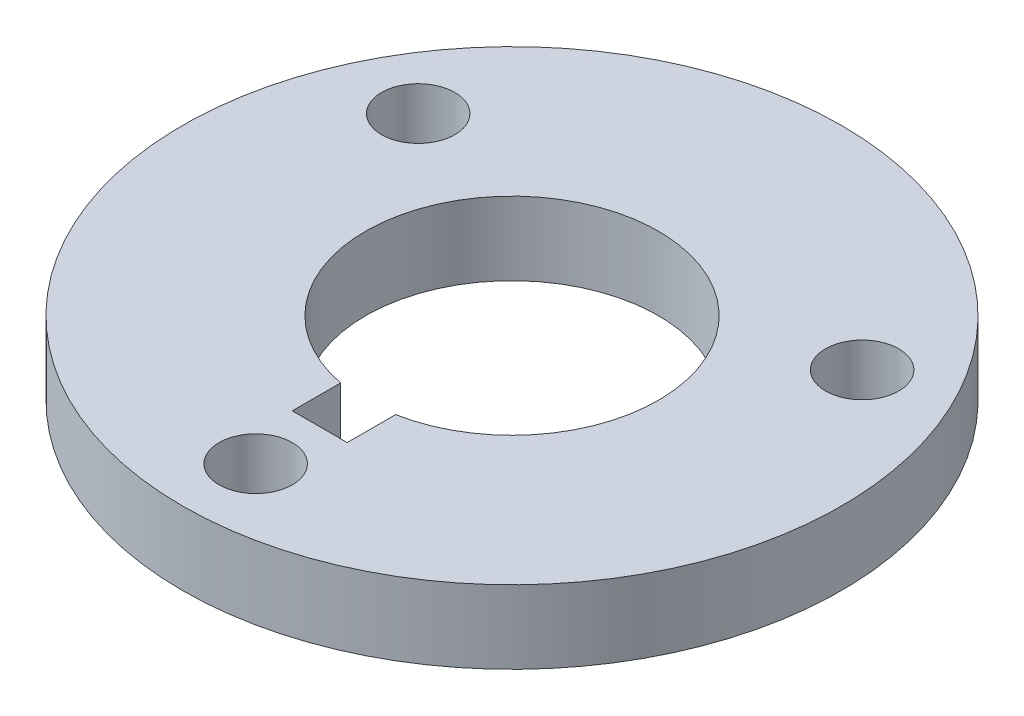
ISO-10303-21;
HEADER;
FILE_DESCRIPTION(('STEP AP214'),'2;1');
FILE_NAME('part.step','',(''),(''),'','','');
FILE_SCHEMA(('AUTOMOTIVE_DESIGN { 1 0 10303 214 1 1 1 1 }'));
ENDSEC;
DATA;
#1=APPLICATION_CONTEXT('core data for automotive mechanical design processes');
#2=APPLICATION_PROTOCOL_DEFINITION('international standard','automotive_design',2000,#1);
#3=PRODUCT_CONTEXT('',#1,'mechanical');
#4=PRODUCT('Part','Part','',(#3));
#5=PRODUCT_RELATED_PRODUCT_CATEGORY('part','',(#4));
#6=PRODUCT_DEFINITION_FORMATION('','',#4);
#7=PRODUCT_DEFINITION_CONTEXT('part definition',#1,'design');
#8=PRODUCT_DEFINITION('design','',#6,#7);
#9=PRODUCT_DEFINITION_SHAPE('','',#8);
#10=(LENGTH_UNIT() NAMED_UNIT(*) SI_UNIT(.MILLI.,.METRE.));
#11=(NAMED_UNIT(*) PLANE_ANGLE_UNIT() SI_UNIT($,.RADIAN.));
#12=(NAMED_UNIT(*) SI_UNIT($,.STERADIAN.) SOLID_ANGLE_UNIT());
#13=UNCERTAINTY_MEASURE_WITH_UNIT(LENGTH_MEASURE(1.E-05),#10,'distance_accuracy_value','');
#14=(GEOMETRIC_REPRESENTATION_CONTEXT(3) GLOBAL_UNCERTAINTY_ASSIGNED_CONTEXT((#13)) GLOBAL_UNIT_ASSIGNED_CONTEXT((#10,
#11,#12)) REPRESENTATION_CONTEXT('',''));
#15=CARTESIAN_POINT('',(0.,0.,0.));
#16=DIRECTION('',(0.,0.,1.));
#17=DIRECTION('',(1.,0.,0.));
#18=AXIS2_PLACEMENT_3D('',#15,#16,#17);
#19=CARTESIAN_POINT('',(0.,3.175,0.));
#20=DIRECTION('',(0.,-1.,0.));
#21=DIRECTION('',(0.,0.,-1.));
#22=AXIS2_PLACEMENT_3D('',#19,#20,#21);
#23=CYLINDRICAL_SURFACE('',#22,6.35);
#24=CARTESIAN_POINT('',(0.,0.,0.));
#25=DIRECTION('',(0.,1.,0.));
#26=DIRECTION('',(0.,0.,1.));
#27=AXIS2_PLACEMENT_3D('',#24,#25,#26);
#28=CIRCLE('',#27,6.35);
#29=CARTESIAN_POINT('',(1.190625,0.,6.23738022805849));
#30=VERTEX_POINT('',#29);
#31=CARTESIAN_POINT('',(-1.190625,0.,6.23738022805849));
#32=VERTEX_POINT('',#31);
#33=EDGE_CURVE('E109',#30,#32,#28,.T.);
#34=ORIENTED_EDGE('',*,*,#33,.F.);
#35=DIRECTION('',(0.,-1.,0.));
#36=VECTOR('',#35,1.);
#37=CARTESIAN_POINT('',(1.190625,3.175,6.23738022805849));
#38=LINE('',#37,#36);
#39=CARTESIAN_POINT('',(1.190625,3.175,6.23738022805849));
#40=VERTEX_POINT('',#39);
#41=EDGE_CURVE('E11',#40,#30,#38,.T.);
#42=ORIENTED_EDGE('',*,*,#41,.F.);
#43=CARTESIAN_POINT('',(0.,3.175,0.));
#44=DIRECTION('',(0.,1.,0.));
#45=DIRECTION('',(0.,0.,1.));
#46=AXIS2_PLACEMENT_3D('',#43,#44,#45);
#47=CIRCLE('',#46,6.35);
#48=CARTESIAN_POINT('',(-1.190625,3.175,6.23738022805849));
#49=VERTEX_POINT('',#48);
#50=EDGE_CURVE('E82',#40,#49,#47,.T.);
#51=ORIENTED_EDGE('',*,*,#50,.T.);
#52=DIRECTION('',(0.,-1.,0.));
#53=VECTOR('',#52,1.);
#54=CARTESIAN_POINT('',(-1.190625,3.175,6.23738022805849));
#55=LINE('',#54,#53);
#56=EDGE_CURVE('E49',#49,#32,#55,.T.);
#57=ORIENTED_EDGE('',*,*,#56,.T.);
#58=EDGE_LOOP('',(#34,#42,#51,#57));
#59=FACE_BOUND('',#58,.T.);
#60=ADVANCED_FACE('F32',(#59),#23,.F.);
#61=CARTESIAN_POINT('',(1.190625,3.175,0.));
#62=DIRECTION('',(1.,0.,0.));
#63=DIRECTION('',(0.,0.,-1.));
#64=AXIS2_PLACEMENT_3D('',#61,#62,#63);
#65=PLANE('',#64);
#66=DIRECTION('',(0.,0.,1.));
#67=VECTOR('',#66,1.);
#68=CARTESIAN_POINT('',(1.190625,0.,0.));
#69=LINE('',#68,#67);
#70=CARTESIAN_POINT('',(1.190625,0.,8.334375));
#71=VERTEX_POINT('',#70);
#72=EDGE_CURVE('E88',#30,#71,#69,.T.);
#73=ORIENTED_EDGE('',*,*,#72,.T.);
#74=DIRECTION('',(0.,-1.,0.));
#75=VECTOR('',#74,1.);
#76=CARTESIAN_POINT('',(1.190625,3.175,8.334375));
#77=LINE('',#76,#75);
#78=CARTESIAN_POINT('',(1.190625,3.175,8.334375));
#79=VERTEX_POINT('',#78);
#80=EDGE_CURVE('E41',#79,#71,#77,.T.);
#81=ORIENTED_EDGE('',*,*,#80,.F.);
#82=DIRECTION('',(0.,0.,1.));
#83=VECTOR('',#82,1.);
#84=CARTESIAN_POINT('',(1.190625,3.175,0.));
#85=LINE('',#84,#83);
#86=EDGE_CURVE('E75',#40,#79,#85,.T.);
#87=ORIENTED_EDGE('',*,*,#86,.F.);
#88=ORIENTED_EDGE('',*,*,#41,.T.);
#89=EDGE_LOOP('',(#73,#81,#87,#88));
#90=FACE_BOUND('',#89,.T.);
#91=ADVANCED_FACE('F86',(#90),#65,.F.);
#92=CARTESIAN_POINT('',(0.,3.175,8.334375));
#93=DIRECTION('',(0.,0.,-1.));
#94=DIRECTION('',(-1.,0.,0.));
#95=AXIS2_PLACEMENT_3D('',#92,#93,#94);
#96=PLANE('',#95);
#97=DIRECTION('',(1.,0.,0.));
#98=VECTOR('',#97,1.);
#99=CARTESIAN_POINT('',(0.,0.,8.334375));
#100=LINE('',#99,#98);
#101=CARTESIAN_POINT('',(-1.190625,0.,8.334375));
#102=VERTEX_POINT('',#101);
#103=EDGE_CURVE('E112',#102,#71,#100,.T.);
#104=ORIENTED_EDGE('',*,*,#103,.F.);
#105=DIRECTION('',(0.,-1.,0.));
#106=VECTOR('',#105,1.);
#107=CARTESIAN_POINT('',(-1.190625,3.175,8.334375));
#108=LINE('',#107,#106);
#109=CARTESIAN_POINT('',(-1.190625,3.175,8.334375));
#110=VERTEX_POINT('',#109);
#111=EDGE_CURVE('E62',#110,#102,#108,.T.);
#112=ORIENTED_EDGE('',*,*,#111,.F.);
#113=DIRECTION('',(1.,0.,0.));
#114=VECTOR('',#113,1.);
#115=CARTESIAN_POINT('',(0.,3.175,8.334375));
#116=LINE('',#115,#114);
#117=EDGE_CURVE('E81',#110,#79,#116,.T.);
#118=ORIENTED_EDGE('',*,*,#117,.T.);
#119=ORIENTED_EDGE('',*,*,#80,.T.);
#120=EDGE_LOOP('',(#104,#112,#118,#119));
#121=FACE_BOUND('',#120,.T.);
#122=ADVANCED_FACE('F91',(#121),#96,.T.);
#123=CARTESIAN_POINT('',(9.62370729955481,3.175,-5.55625000000014));
#124=DIRECTION('',(0.,-1.,0.));
#125=DIRECTION('',(0.,0.,-1.));
#126=AXIS2_PLACEMENT_3D('',#123,#124,#125);
#127=CYLINDRICAL_SURFACE('',#126,1.5875);
#128=CARTESIAN_POINT('',(9.62370729955481,3.175,-5.55625000000014));
#129=DIRECTION('',(0.,1.,0.));
#130=DIRECTION('',(0.,0.,1.));
#131=AXIS2_PLACEMENT_3D('',#128,#129,#130);
#132=CIRCLE('',#131,1.5875);
#133=CARTESIAN_POINT('',(9.62370729955481,3.175,-3.96875000000014));
#134=VERTEX_POINT('',#133);
#135=EDGE_CURVE('E100',#134,#134,#132,.T.);
#136=ORIENTED_EDGE('',*,*,#135,.T.);
#137=EDGE_LOOP('',(#136));
#138=FACE_BOUND('',#137,.T.);
#139=CARTESIAN_POINT('',(9.62370729955481,0.,-5.55625000000014));
#140=DIRECTION('',(0.,1.,0.));
#141=DIRECTION('',(0.,0.,1.));
#142=AXIS2_PLACEMENT_3D('',#139,#140,#141);
#143=CIRCLE('',#142,1.5875);
#144=CARTESIAN_POINT('',(9.62370729955481,0.,-3.96875000000014));
#145=VERTEX_POINT('',#144);
#146=EDGE_CURVE('E120',#145,#145,#143,.T.);
#147=ORIENTED_EDGE('',*,*,#146,.F.);
#148=EDGE_LOOP('',(#147));
#149=FACE_BOUND('',#148,.T.);
#150=ADVANCED_FACE('F143',(#138,#149),#127,.F.);
#151=CARTESIAN_POINT('',(-9.62370729955481,3.175,-5.55625000000013));
#152=DIRECTION('',(0.,-1.,0.));
#153=DIRECTION('',(0.,0.,-1.));
#154=AXIS2_PLACEMENT_3D('',#151,#152,#153);
#155=CYLINDRICAL_SURFACE('',#154,1.5875);
#156=CARTESIAN_POINT('',(-9.62370729955481,3.175,-5.55625000000013));
#157=DIRECTION('',(0.,1.,0.));
#158=DIRECTION('',(0.,0.,1.));
#159=AXIS2_PLACEMENT_3D('',#156,#157,#158);
#160=CIRCLE('',#159,1.5875);
#161=CARTESIAN_POINT('',(-9.62370729955481,3.175,-3.96875000000013));
#162=VERTEX_POINT('',#161);
#163=EDGE_CURVE('E94',#162,#162,#160,.T.);
#164=ORIENTED_EDGE('',*,*,#163,.T.);
#165=EDGE_LOOP('',(#164));
#166=FACE_BOUND('',#165,.T.);
#167=CARTESIAN_POINT('',(-9.62370729955481,0.,-5.55625000000013));
#168=DIRECTION('',(0.,1.,0.));
#169=DIRECTION('',(0.,0.,1.));
#170=AXIS2_PLACEMENT_3D('',#167,#168,#169);
#171=CIRCLE('',#170,1.5875);
#172=CARTESIAN_POINT('',(-9.62370729955481,0.,-3.96875000000013));
#173=VERTEX_POINT('',#172);
#174=EDGE_CURVE('E117',#173,#173,#171,.T.);
#175=ORIENTED_EDGE('',*,*,#174,.F.);
#176=EDGE_LOOP('',(#175));
#177=FACE_BOUND('',#176,.T.);
#178=ADVANCED_FACE('F136',(#166,#177),#155,.F.);
#179=CARTESIAN_POINT('',(-1.190625,3.175,0.));
#180=DIRECTION('',(1.,0.,0.));
#181=DIRECTION('',(0.,0.,-1.));
#182=AXIS2_PLACEMENT_3D('',#179,#180,#181);
#183=PLANE('',#182);
#184=DIRECTION('',(0.,0.,1.));
#185=VECTOR('',#184,1.);
#186=CARTESIAN_POINT('',(-1.190625,0.,0.));
#187=LINE('',#186,#185);
#188=EDGE_CURVE('E114',#32,#102,#187,.T.);
#189=ORIENTED_EDGE('',*,*,#188,.F.);
#190=ORIENTED_EDGE('',*,*,#56,.F.);
#191=DIRECTION('',(0.,0.,1.));
#192=VECTOR('',#191,1.);
#193=CARTESIAN_POINT('',(-1.190625,3.175,0.));
#194=LINE('',#193,#192);
#195=EDGE_CURVE('E92',#49,#110,#194,.T.);
#196=ORIENTED_EDGE('',*,*,#195,.T.);
#197=ORIENTED_EDGE('',*,*,#111,.T.);
#198=EDGE_LOOP('',(#189,#190,#196,#197));
#199=FACE_BOUND('',#198,.T.);
#200=ADVANCED_FACE('F134',(#199),#183,.T.);
#201=CARTESIAN_POINT('',(0.,3.175,11.1125000000003));
#202=DIRECTION('',(0.,-1.,0.));
#203=DIRECTION('',(0.,0.,-1.));
#204=AXIS2_PLACEMENT_3D('',#201,#202,#203);
#205=CYLINDRICAL_SURFACE('',#204,1.5875);
#206=CARTESIAN_POINT('',(0.,3.175,11.1125000000003));
#207=DIRECTION('',(0.,1.,0.));
#208=DIRECTION('',(0.,0.,1.));
#209=AXIS2_PLACEMENT_3D('',#206,#207,#208);
#210=CIRCLE('',#209,1.5875);
#211=CARTESIAN_POINT('',(0.,3.175,12.7000000000003));
#212=VERTEX_POINT('',#211);
#213=EDGE_CURVE('E126',#212,#212,#210,.T.);
#214=ORIENTED_EDGE('',*,*,#213,.T.);
#215=EDGE_LOOP('',(#214));
#216=FACE_BOUND('',#215,.T.);
#217=CARTESIAN_POINT('',(0.,0.,11.1125000000003));
#218=DIRECTION('',(0.,1.,0.));
#219=DIRECTION('',(0.,0.,1.));
#220=AXIS2_PLACEMENT_3D('',#217,#218,#219);
#221=CIRCLE('',#220,1.5875);
#222=CARTESIAN_POINT('',(0.,0.,12.7000000000003));
#223=VERTEX_POINT('',#222);
#224=EDGE_CURVE('E106',#223,#223,#221,.T.);
#225=ORIENTED_EDGE('',*,*,#224,.F.);
#226=EDGE_LOOP('',(#225));
#227=FACE_BOUND('',#226,.T.);
#228=ADVANCED_FACE('F34',(#216,#227),#205,.F.);
#229=CARTESIAN_POINT('',(0.,3.175,0.));
#230=DIRECTION('',(0.,-1.,0.));
#231=DIRECTION('',(0.,0.,-1.));
#232=AXIS2_PLACEMENT_3D('',#229,#230,#231);
#233=CYLINDRICAL_SURFACE('',#232,14.2875);
#234=CARTESIAN_POINT('',(0.,3.175,0.));
#235=DIRECTION('',(0.,1.,0.));
#236=DIRECTION('',(0.,0.,1.));
#237=AXIS2_PLACEMENT_3D('',#234,#235,#236);
#238=CIRCLE('',#237,14.2875);
#239=CARTESIAN_POINT('',(0.,3.175,14.2875));
#240=VERTEX_POINT('',#239);
#241=EDGE_CURVE('E103',#240,#240,#238,.T.);
#242=ORIENTED_EDGE('',*,*,#241,.F.);
#243=EDGE_LOOP('',(#242));
#244=FACE_BOUND('',#243,.T.);
#245=CARTESIAN_POINT('',(0.,0.,0.));
#246=DIRECTION('',(0.,1.,0.));
#247=DIRECTION('',(0.,0.,1.));
#248=AXIS2_PLACEMENT_3D('',#245,#246,#247);
#249=CIRCLE('',#248,14.2875);
#250=CARTESIAN_POINT('',(0.,0.,14.2875));
#251=VERTEX_POINT('',#250);
#252=EDGE_CURVE('E123',#251,#251,#249,.T.);
#253=ORIENTED_EDGE('',*,*,#252,.T.);
#254=EDGE_LOOP('',(#253));
#255=FACE_BOUND('',#254,.T.);
#256=ADVANCED_FACE('F142',(#244,#255),#233,.T.);
#257=CARTESIAN_POINT('',(0.,3.175,0.));
#258=DIRECTION('',(0.,1.,0.));
#259=DIRECTION('',(0.,0.,1.));
#260=AXIS2_PLACEMENT_3D('',#257,#258,#259);
#261=PLANE('',#260);
#262=ORIENTED_EDGE('',*,*,#213,.F.);
#263=EDGE_LOOP('',(#262));
#264=FACE_BOUND('',#263,.T.);
#265=ORIENTED_EDGE('',*,*,#50,.F.);
#266=ORIENTED_EDGE('',*,*,#86,.T.);
#267=ORIENTED_EDGE('',*,*,#117,.F.);
#268=ORIENTED_EDGE('',*,*,#195,.F.);
#269=EDGE_LOOP('',(#265,#266,#267,#268));
#270=FACE_BOUND('',#269,.T.);
#271=ORIENTED_EDGE('',*,*,#163,.F.);
#272=EDGE_LOOP('',(#271));
#273=FACE_BOUND('',#272,.T.);
#274=ORIENTED_EDGE('',*,*,#135,.F.);
#275=EDGE_LOOP('',(#274));
#276=FACE_BOUND('',#275,.T.);
#277=ORIENTED_EDGE('',*,*,#241,.T.);
#278=EDGE_LOOP('',(#277));
#279=FACE_BOUND('',#278,.T.);
#280=ADVANCED_FACE('F77',(#264,#270,#273,#276,#279),#261,.T.);
#281=CARTESIAN_POINT('',(0.,0.,0.));
#282=DIRECTION('',(0.,1.,0.));
#283=DIRECTION('',(0.,0.,1.));
#284=AXIS2_PLACEMENT_3D('',#281,#282,#283);
#285=PLANE('',#284);
#286=ORIENTED_EDGE('',*,*,#224,.T.);
#287=EDGE_LOOP('',(#286));
#288=FACE_BOUND('',#287,.T.);
#289=ORIENTED_EDGE('',*,*,#33,.T.);
#290=ORIENTED_EDGE('',*,*,#188,.T.);
#291=ORIENTED_EDGE('',*,*,#103,.T.);
#292=ORIENTED_EDGE('',*,*,#72,.F.);
#293=EDGE_LOOP('',(#289,#290,#291,#292));
#294=FACE_BOUND('',#293,.T.);
#295=ORIENTED_EDGE('',*,*,#174,.T.);
#296=EDGE_LOOP('',(#295));
#297=FACE_BOUND('',#296,.T.);
#298=ORIENTED_EDGE('',*,*,#146,.T.);
#299=EDGE_LOOP('',(#298));
#300=FACE_BOUND('',#299,.T.);
#301=ORIENTED_EDGE('',*,*,#252,.F.);
#302=EDGE_LOOP('',(#301));
#303=FACE_BOUND('',#302,.T.);
#304=ADVANCED_FACE('F165',(#288,#294,#297,#300,#303),#285,.F.);
#305=CLOSED_SHELL('',(#60,#91,#122,#150,#178,#200,#228,#256,#280,#304));
#306=MANIFOLD_SOLID_BREP('B2',#305);
#307=ADVANCED_BREP_SHAPE_REPRESENTATION('',(#18,#306),#14);
#308=SHAPE_DEFINITION_REPRESENTATION(#9,#307);
ENDSEC;
END-ISO-10303-21;
